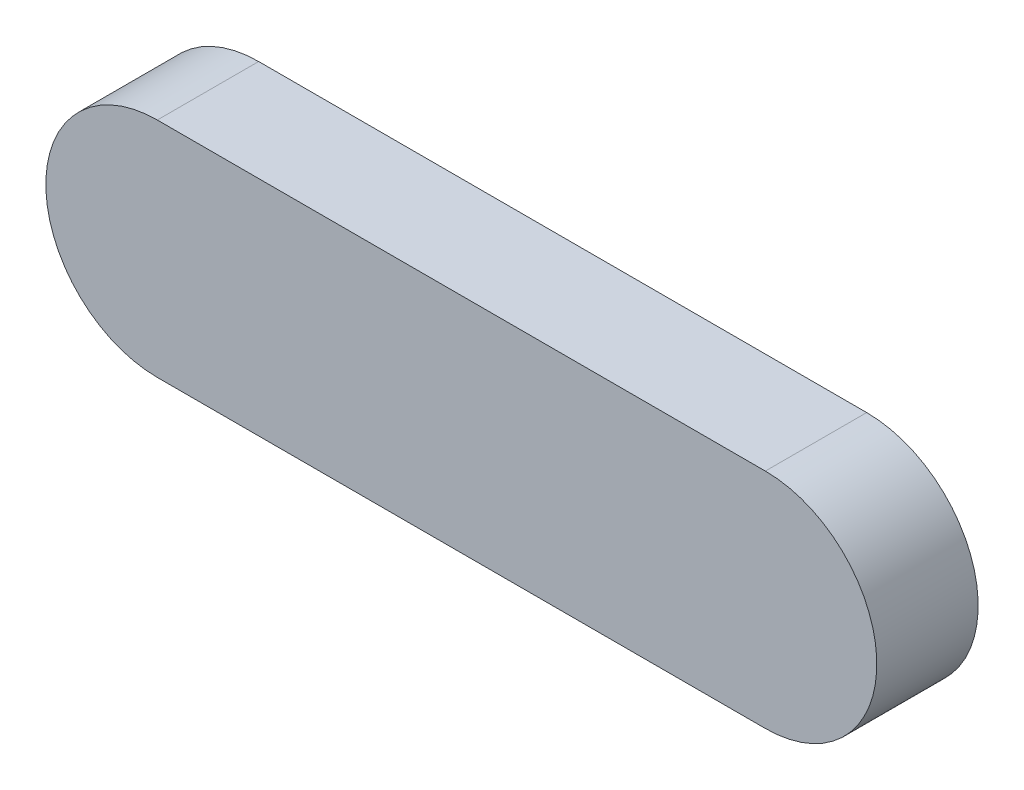
ISO-10303-21;
HEADER;
FILE_DESCRIPTION(('STEP AP214'),'2;1');
FILE_NAME('part.step','',(''),(''),'','','');
FILE_SCHEMA(('AUTOMOTIVE_DESIGN { 1 0 10303 214 1 1 1 1 }'));
ENDSEC;
DATA;
#1=APPLICATION_CONTEXT('core data for automotive mechanical design processes');
#2=APPLICATION_PROTOCOL_DEFINITION('international standard','automotive_design',2000,#1);
#3=PRODUCT_CONTEXT('',#1,'mechanical');
#4=PRODUCT('Part','Part','',(#3));
#5=PRODUCT_RELATED_PRODUCT_CATEGORY('part','',(#4));
#6=PRODUCT_DEFINITION_FORMATION('','',#4);
#7=PRODUCT_DEFINITION_CONTEXT('part definition',#1,'design');
#8=PRODUCT_DEFINITION('design','',#6,#7);
#9=PRODUCT_DEFINITION_SHAPE('','',#8);
#10=(LENGTH_UNIT() NAMED_UNIT(*) SI_UNIT(.MILLI.,.METRE.));
#11=(NAMED_UNIT(*) PLANE_ANGLE_UNIT() SI_UNIT($,.RADIAN.));
#12=(NAMED_UNIT(*) SI_UNIT($,.STERADIAN.) SOLID_ANGLE_UNIT());
#13=UNCERTAINTY_MEASURE_WITH_UNIT(LENGTH_MEASURE(1.E-05),#10,'distance_accuracy_value','');
#14=(GEOMETRIC_REPRESENTATION_CONTEXT(3) GLOBAL_UNCERTAINTY_ASSIGNED_CONTEXT((#13)) GLOBAL_UNIT_ASSIGNED_CONTEXT((#10,
#11,#12)) REPRESENTATION_CONTEXT('',''));
#15=CARTESIAN_POINT('',(0.,0.,0.));
#16=DIRECTION('',(0.,0.,1.));
#17=DIRECTION('',(1.,0.,0.));
#18=AXIS2_PLACEMENT_3D('',#15,#16,#17);
#19=CARTESIAN_POINT('',(20.,50.,10.));
#20=DIRECTION('',(0.,0.,-1.));
#21=DIRECTION('',(-1.,0.,0.));
#22=AXIS2_PLACEMENT_3D('',#19,#20,#21);
#23=CYLINDRICAL_SURFACE('',#22,11.);
#24=CARTESIAN_POINT('',(20.,50.,0.));
#25=DIRECTION('',(0.,0.,1.));
#26=DIRECTION('',(1.,0.,0.));
#27=AXIS2_PLACEMENT_3D('',#24,#25,#26);
#28=CIRCLE('',#27,11.);
#29=CARTESIAN_POINT('',(20.,61.,0.));
#30=VERTEX_POINT('',#29);
#31=CARTESIAN_POINT('',(20.,39.,0.));
#32=VERTEX_POINT('',#31);
#33=EDGE_CURVE('E104',#30,#32,#28,.T.);
#34=ORIENTED_EDGE('',*,*,#33,.T.);
#35=DIRECTION('',(0.,0.,-1.));
#36=VECTOR('',#35,1.);
#37=CARTESIAN_POINT('',(20.,39.,10.));
#38=LINE('',#37,#36);
#39=CARTESIAN_POINT('',(20.,39.,10.));
#40=VERTEX_POINT('',#39);
#41=EDGE_CURVE('E11',#40,#32,#38,.T.);
#42=ORIENTED_EDGE('',*,*,#41,.F.);
#43=CARTESIAN_POINT('',(20.,50.,10.));
#44=DIRECTION('',(0.,0.,1.));
#45=DIRECTION('',(1.,0.,0.));
#46=AXIS2_PLACEMENT_3D('',#43,#44,#45);
#47=CIRCLE('',#46,11.);
#48=CARTESIAN_POINT('',(20.,61.,10.));
#49=VERTEX_POINT('',#48);
#50=EDGE_CURVE('E92',#49,#40,#47,.T.);
#51=ORIENTED_EDGE('',*,*,#50,.F.);
#52=DIRECTION('',(0.,0.,-1.));
#53=VECTOR('',#52,1.);
#54=CARTESIAN_POINT('',(20.,61.,10.));
#55=LINE('',#54,#53);
#56=EDGE_CURVE('E100',#49,#30,#55,.T.);
#57=ORIENTED_EDGE('',*,*,#56,.T.);
#58=EDGE_LOOP('',(#34,#42,#51,#57));
#59=FACE_BOUND('',#58,.T.);
#60=ADVANCED_FACE('F41',(#59),#23,.T.);
#61=CARTESIAN_POINT('',(20.,39.,10.));
#62=DIRECTION('',(0.,1.,0.));
#63=DIRECTION('',(0.,0.,1.));
#64=AXIS2_PLACEMENT_3D('',#61,#62,#63);
#65=PLANE('',#64);
#66=DIRECTION('',(1.,0.,0.));
#67=VECTOR('',#66,1.);
#68=CARTESIAN_POINT('',(20.,39.,0.));
#69=LINE('',#68,#67);
#70=CARTESIAN_POINT('',(80.,39.,0.));
#71=VERTEX_POINT('',#70);
#72=EDGE_CURVE('E96',#32,#71,#69,.T.);
#73=ORIENTED_EDGE('',*,*,#72,.T.);
#74=DIRECTION('',(0.,0.,-1.));
#75=VECTOR('',#74,1.);
#76=CARTESIAN_POINT('',(80.,39.,10.));
#77=LINE('',#76,#75);
#78=CARTESIAN_POINT('',(80.,39.,10.));
#79=VERTEX_POINT('',#78);
#80=EDGE_CURVE('E49',#79,#71,#77,.T.);
#81=ORIENTED_EDGE('',*,*,#80,.F.);
#82=DIRECTION('',(1.,0.,0.));
#83=VECTOR('',#82,1.);
#84=CARTESIAN_POINT('',(20.,39.,10.));
#85=LINE('',#84,#83);
#86=EDGE_CURVE('E87',#40,#79,#85,.T.);
#87=ORIENTED_EDGE('',*,*,#86,.F.);
#88=ORIENTED_EDGE('',*,*,#41,.T.);
#89=EDGE_LOOP('',(#73,#81,#87,#88));
#90=FACE_BOUND('',#89,.T.);
#91=ADVANCED_FACE('F95',(#90),#65,.F.);
#92=CARTESIAN_POINT('',(80.,50.,10.));
#93=DIRECTION('',(0.,0.,-1.));
#94=DIRECTION('',(-1.,0.,0.));
#95=AXIS2_PLACEMENT_3D('',#92,#93,#94);
#96=CYLINDRICAL_SURFACE('',#95,11.);
#97=CARTESIAN_POINT('',(80.,50.,0.));
#98=DIRECTION('',(0.,0.,1.));
#99=DIRECTION('',(1.,0.,0.));
#100=AXIS2_PLACEMENT_3D('',#97,#98,#99);
#101=CIRCLE('',#100,11.);
#102=CARTESIAN_POINT('',(80.,61.,0.));
#103=VERTEX_POINT('',#102);
#104=EDGE_CURVE('E74',#71,#103,#101,.T.);
#105=ORIENTED_EDGE('',*,*,#104,.T.);
#106=DIRECTION('',(0.,0.,-1.));
#107=VECTOR('',#106,1.);
#108=CARTESIAN_POINT('',(80.,61.,10.));
#109=LINE('',#108,#107);
#110=CARTESIAN_POINT('',(80.,61.,10.));
#111=VERTEX_POINT('',#110);
#112=EDGE_CURVE('E97',#111,#103,#109,.T.);
#113=ORIENTED_EDGE('',*,*,#112,.F.);
#114=CARTESIAN_POINT('',(80.,50.,10.));
#115=DIRECTION('',(0.,0.,1.));
#116=DIRECTION('',(1.,0.,0.));
#117=AXIS2_PLACEMENT_3D('',#114,#115,#116);
#118=CIRCLE('',#117,11.);
#119=EDGE_CURVE('E90',#79,#111,#118,.T.);
#120=ORIENTED_EDGE('',*,*,#119,.F.);
#121=ORIENTED_EDGE('',*,*,#80,.T.);
#122=EDGE_LOOP('',(#105,#113,#120,#121));
#123=FACE_BOUND('',#122,.T.);
#124=ADVANCED_FACE('F98',(#123),#96,.T.);
#125=CARTESIAN_POINT('',(20.,61.,10.));
#126=DIRECTION('',(0.,-1.,0.));
#127=DIRECTION('',(0.,0.,-1.));
#128=AXIS2_PLACEMENT_3D('',#125,#126,#127);
#129=PLANE('',#128);
#130=DIRECTION('',(-1.,0.,0.));
#131=VECTOR('',#130,1.);
#132=CARTESIAN_POINT('',(20.,61.,0.));
#133=LINE('',#132,#131);
#134=EDGE_CURVE('E80',#103,#30,#133,.T.);
#135=ORIENTED_EDGE('',*,*,#134,.T.);
#136=ORIENTED_EDGE('',*,*,#56,.F.);
#137=DIRECTION('',(-1.,0.,0.));
#138=VECTOR('',#137,1.);
#139=CARTESIAN_POINT('',(20.,61.,10.));
#140=LINE('',#139,#138);
#141=EDGE_CURVE('E57',#111,#49,#140,.T.);
#142=ORIENTED_EDGE('',*,*,#141,.F.);
#143=ORIENTED_EDGE('',*,*,#112,.T.);
#144=EDGE_LOOP('',(#135,#136,#142,#143));
#145=FACE_BOUND('',#144,.T.);
#146=ADVANCED_FACE('F111',(#145),#129,.F.);
#147=CARTESIAN_POINT('',(20.,50.,10.));
#148=DIRECTION('',(0.,0.,1.));
#149=DIRECTION('',(1.,0.,0.));
#150=AXIS2_PLACEMENT_3D('',#147,#148,#149);
#151=PLANE('',#150);
#152=ORIENTED_EDGE('',*,*,#50,.T.);
#153=ORIENTED_EDGE('',*,*,#86,.T.);
#154=ORIENTED_EDGE('',*,*,#119,.T.);
#155=ORIENTED_EDGE('',*,*,#141,.T.);
#156=EDGE_LOOP('',(#152,#153,#154,#155));
#157=FACE_BOUND('',#156,.T.);
#158=ADVANCED_FACE('F88',(#157),#151,.T.);
#159=CARTESIAN_POINT('',(20.,50.,0.));
#160=DIRECTION('',(0.,0.,1.));
#161=DIRECTION('',(1.,0.,0.));
#162=AXIS2_PLACEMENT_3D('',#159,#160,#161);
#163=PLANE('',#162);
#164=ORIENTED_EDGE('',*,*,#33,.F.);
#165=ORIENTED_EDGE('',*,*,#134,.F.);
#166=ORIENTED_EDGE('',*,*,#104,.F.);
#167=ORIENTED_EDGE('',*,*,#72,.F.);
#168=EDGE_LOOP('',(#164,#165,#166,#167));
#169=FACE_BOUND('',#168,.T.);
#170=ADVANCED_FACE('F114',(#169),#163,.F.);
#171=CLOSED_SHELL('',(#60,#91,#124,#146,#158,#170));
#172=MANIFOLD_SOLID_BREP('B2',#171);
#173=ADVANCED_BREP_SHAPE_REPRESENTATION('',(#18,#172),#14);
#174=SHAPE_DEFINITION_REPRESENTATION(#9,#173);
ENDSEC;
END-ISO-10303-21;
